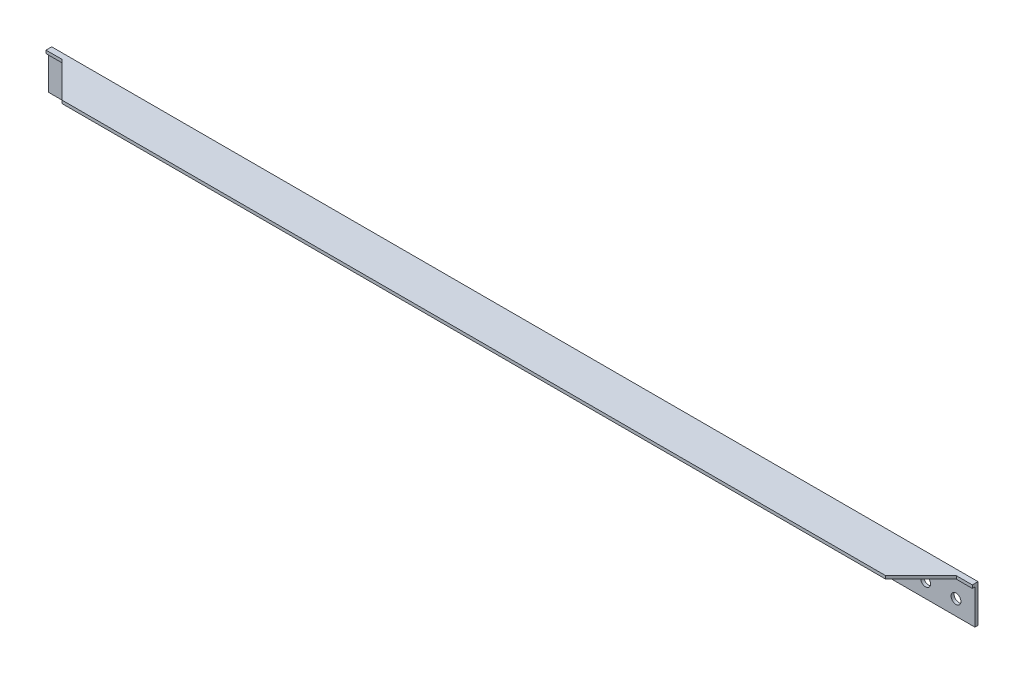
ISO-10303-21;
HEADER;
FILE_DESCRIPTION(('STEP AP214'),'2;1');
FILE_NAME('part.step','',(''),(''),'','','');
FILE_SCHEMA(('AUTOMOTIVE_DESIGN { 1 0 10303 214 1 1 1 1 }'));
ENDSEC;
DATA;
#1=APPLICATION_CONTEXT('core data for automotive mechanical design processes');
#2=APPLICATION_PROTOCOL_DEFINITION('international standard','automotive_design',2000,#1);
#3=PRODUCT_CONTEXT('',#1,'mechanical');
#4=PRODUCT('Part','Part','',(#3));
#5=PRODUCT_RELATED_PRODUCT_CATEGORY('part','',(#4));
#6=PRODUCT_DEFINITION_FORMATION('','',#4);
#7=PRODUCT_DEFINITION_CONTEXT('part definition',#1,'design');
#8=PRODUCT_DEFINITION('design','',#6,#7);
#9=PRODUCT_DEFINITION_SHAPE('','',#8);
#10=(LENGTH_UNIT() NAMED_UNIT(*) SI_UNIT(.MILLI.,.METRE.));
#11=(NAMED_UNIT(*) PLANE_ANGLE_UNIT() SI_UNIT($,.RADIAN.));
#12=(NAMED_UNIT(*) SI_UNIT($,.STERADIAN.) SOLID_ANGLE_UNIT());
#13=UNCERTAINTY_MEASURE_WITH_UNIT(LENGTH_MEASURE(1.E-05),#10,'distance_accuracy_value','');
#14=(GEOMETRIC_REPRESENTATION_CONTEXT(3) GLOBAL_UNCERTAINTY_ASSIGNED_CONTEXT((#13)) GLOBAL_UNIT_ASSIGNED_CONTEXT((#10,
#11,#12)) REPRESENTATION_CONTEXT('',''));
#15=CARTESIAN_POINT('',(0.,0.,0.));
#16=DIRECTION('',(0.,0.,1.));
#17=DIRECTION('',(1.,0.,0.));
#18=AXIS2_PLACEMENT_3D('',#15,#16,#17);
#19=CARTESIAN_POINT('',(-1220.,100.,8.));
#20=DIRECTION('',(0.,0.,-1.));
#21=DIRECTION('',(-1.,0.,0.));
#22=AXIS2_PLACEMENT_3D('',#19,#20,#21);
#23=PLANE('',#22);
#24=CARTESIAN_POINT('',(-80.,39.9999999999999,8.));
#25=DIRECTION('',(0.,0.,1.));
#26=DIRECTION('',(-1.,0.,0.));
#27=AXIS2_PLACEMENT_3D('',#24,#25,#26);
#28=CIRCLE('',#27,13.);
#29=CARTESIAN_POINT('',(-93.,39.9999999999999,8.));
#30=VERTEX_POINT('',#29);
#31=EDGE_CURVE('E143',#30,#30,#28,.T.);
#32=ORIENTED_EDGE('',*,*,#31,.F.);
#33=EDGE_LOOP('',(#32));
#34=FACE_BOUND('',#33,.T.);
#35=CARTESIAN_POINT('',(-160.,39.9999999999999,8.));
#36=DIRECTION('',(0.,0.,1.));
#37=DIRECTION('',(-1.,0.,0.));
#38=AXIS2_PLACEMENT_3D('',#35,#36,#37);
#39=CIRCLE('',#38,13.);
#40=CARTESIAN_POINT('',(-173.,39.9999999999999,8.));
#41=VERTEX_POINT('',#40);
#42=EDGE_CURVE('E149',#41,#41,#39,.T.);
#43=ORIENTED_EDGE('',*,*,#42,.F.);
#44=EDGE_LOOP('',(#43));
#45=FACE_BOUND('',#44,.T.);
#46=CARTESIAN_POINT('',(160.,39.9999999999999,8.));
#47=DIRECTION('',(0.,0.,1.));
#48=DIRECTION('',(1.,0.,0.));
#49=AXIS2_PLACEMENT_3D('',#46,#47,#48);
#50=CIRCLE('',#49,13.);
#51=CARTESIAN_POINT('',(173.,39.9999999999999,8.));
#52=VERTEX_POINT('',#51);
#53=EDGE_CURVE('E155',#52,#52,#50,.T.);
#54=ORIENTED_EDGE('',*,*,#53,.F.);
#55=EDGE_LOOP('',(#54));
#56=FACE_BOUND('',#55,.T.);
#57=CARTESIAN_POINT('',(80.,39.9999999999999,8.));
#58=DIRECTION('',(0.,0.,1.));
#59=DIRECTION('',(1.,0.,0.));
#60=AXIS2_PLACEMENT_3D('',#57,#58,#59);
#61=CIRCLE('',#60,13.);
#62=CARTESIAN_POINT('',(93.,39.9999999999999,8.));
#63=VERTEX_POINT('',#62);
#64=EDGE_CURVE('E161',#63,#63,#61,.T.);
#65=ORIENTED_EDGE('',*,*,#64,.F.);
#66=EDGE_LOOP('',(#65));
#67=FACE_BOUND('',#66,.T.);
#68=CARTESIAN_POINT('',(0.,39.9999999999999,8.));
#69=DIRECTION('',(0.,0.,1.));
#70=DIRECTION('',(1.,0.,0.));
#71=AXIS2_PLACEMENT_3D('',#68,#69,#70);
#72=CIRCLE('',#71,13.);
#73=CARTESIAN_POINT('',(13.,39.9999999999999,8.));
#74=VERTEX_POINT('',#73);
#75=EDGE_CURVE('E167',#74,#74,#72,.T.);
#76=ORIENTED_EDGE('',*,*,#75,.F.);
#77=EDGE_LOOP('',(#76));
#78=FACE_BOUND('',#77,.T.);
#79=CARTESIAN_POINT('',(-1090.,40.,8.));
#80=DIRECTION('',(0.,0.,1.));
#81=DIRECTION('',(-1.,0.,0.));
#82=AXIS2_PLACEMENT_3D('',#79,#80,#81);
#83=CIRCLE('',#82,12.9999999999998);
#84=CARTESIAN_POINT('',(-1103.,40.,8.));
#85=VERTEX_POINT('',#84);
#86=EDGE_CURVE('E173',#85,#85,#83,.T.);
#87=ORIENTED_EDGE('',*,*,#86,.F.);
#88=EDGE_LOOP('',(#87));
#89=FACE_BOUND('',#88,.T.);
#90=CARTESIAN_POINT('',(-1170.,40.,8.));
#91=DIRECTION('',(0.,0.,1.));
#92=DIRECTION('',(-1.,0.,0.));
#93=AXIS2_PLACEMENT_3D('',#90,#91,#92);
#94=CIRCLE('',#93,12.9999999999998);
#95=CARTESIAN_POINT('',(-1183.,40.,8.));
#96=VERTEX_POINT('',#95);
#97=EDGE_CURVE('E179',#96,#96,#94,.T.);
#98=ORIENTED_EDGE('',*,*,#97,.F.);
#99=EDGE_LOOP('',(#98));
#100=FACE_BOUND('',#99,.T.);
#101=CARTESIAN_POINT('',(1170.,40.,8.));
#102=DIRECTION('',(0.,0.,1.));
#103=DIRECTION('',(1.,0.,0.));
#104=AXIS2_PLACEMENT_3D('',#101,#102,#103);
#105=CIRCLE('',#104,12.9999999999998);
#106=CARTESIAN_POINT('',(1183.,40.,8.));
#107=VERTEX_POINT('',#106);
#108=EDGE_CURVE('E185',#107,#107,#105,.T.);
#109=ORIENTED_EDGE('',*,*,#108,.F.);
#110=EDGE_LOOP('',(#109));
#111=FACE_BOUND('',#110,.T.);
#112=CARTESIAN_POINT('',(1090.,40.,8.));
#113=DIRECTION('',(0.,0.,1.));
#114=DIRECTION('',(1.,0.,0.));
#115=AXIS2_PLACEMENT_3D('',#112,#113,#114);
#116=CIRCLE('',#115,12.9999999999998);
#117=CARTESIAN_POINT('',(1103.,40.,8.));
#118=VERTEX_POINT('',#117);
#119=EDGE_CURVE('E191',#118,#118,#116,.T.);
#120=ORIENTED_EDGE('',*,*,#119,.F.);
#121=EDGE_LOOP('',(#120));
#122=FACE_BOUND('',#121,.T.);
#123=DIRECTION('',(1.,0.,0.));
#124=VECTOR('',#123,1.);
#125=CARTESIAN_POINT('',(-1220.,92.,8.));
#126=LINE('',#125,#124);
#127=CARTESIAN_POINT('',(-1220.,92.,8.));
#128=VERTEX_POINT('',#127);
#129=CARTESIAN_POINT('',(1220.,92.,8.));
#130=VERTEX_POINT('',#129);
#131=EDGE_CURVE('E134',#128,#130,#126,.T.);
#132=ORIENTED_EDGE('',*,*,#131,.F.);
#133=DIRECTION('',(0.,-1.,0.));
#134=VECTOR('',#133,1.);
#135=CARTESIAN_POINT('',(-1220.,0.,8.));
#136=LINE('',#135,#134);
#137=CARTESIAN_POINT('',(-1220.,0.,8.));
#138=VERTEX_POINT('',#137);
#139=EDGE_CURVE('E197',#128,#138,#136,.T.);
#140=ORIENTED_EDGE('',*,*,#139,.T.);
#141=DIRECTION('',(1.,0.,0.));
#142=VECTOR('',#141,1.);
#143=CARTESIAN_POINT('',(-1220.,0.,8.));
#144=LINE('',#143,#142);
#145=CARTESIAN_POINT('',(1220.,0.,8.));
#146=VERTEX_POINT('',#145);
#147=EDGE_CURVE('E199',#138,#146,#144,.T.);
#148=ORIENTED_EDGE('',*,*,#147,.T.);
#149=DIRECTION('',(0.,1.,0.));
#150=VECTOR('',#149,1.);
#151=CARTESIAN_POINT('',(1220.,0.,8.));
#152=LINE('',#151,#150);
#153=EDGE_CURVE('E202',#146,#130,#152,.T.);
#154=ORIENTED_EDGE('',*,*,#153,.T.);
#155=EDGE_LOOP('',(#132,#140,#148,#154));
#156=FACE_BOUND('',#155,.T.);
#157=ADVANCED_FACE('F35',(#34,#45,#56,#67,#78,#89,#100,#111,#122,#156),#23,.F.);
#158=CARTESIAN_POINT('',(-1220.,100.,0.));
#159=DIRECTION('',(0.,0.,-1.));
#160=DIRECTION('',(-1.,0.,0.));
#161=AXIS2_PLACEMENT_3D('',#158,#159,#160);
#162=PLANE('',#161);
#163=CARTESIAN_POINT('',(-160.,39.9999999999999,0.));
#164=DIRECTION('',(0.,0.,1.));
#165=DIRECTION('',(-1.,0.,0.));
#166=AXIS2_PLACEMENT_3D('',#163,#164,#165);
#167=CIRCLE('',#166,13.);
#168=CARTESIAN_POINT('',(-173.,39.9999999999999,0.));
#169=VERTEX_POINT('',#168);
#170=EDGE_CURVE('E146',#169,#169,#167,.T.);
#171=ORIENTED_EDGE('',*,*,#170,.T.);
#172=EDGE_LOOP('',(#171));
#173=FACE_BOUND('',#172,.T.);
#174=CARTESIAN_POINT('',(80.,39.9999999999999,0.));
#175=DIRECTION('',(0.,0.,1.));
#176=DIRECTION('',(1.,0.,0.));
#177=AXIS2_PLACEMENT_3D('',#174,#175,#176);
#178=CIRCLE('',#177,13.);
#179=CARTESIAN_POINT('',(93.,39.9999999999999,0.));
#180=VERTEX_POINT('',#179);
#181=EDGE_CURVE('E158',#180,#180,#178,.T.);
#182=ORIENTED_EDGE('',*,*,#181,.T.);
#183=EDGE_LOOP('',(#182));
#184=FACE_BOUND('',#183,.T.);
#185=CARTESIAN_POINT('',(-1090.,40.,0.));
#186=DIRECTION('',(0.,0.,1.));
#187=DIRECTION('',(-1.,0.,0.));
#188=AXIS2_PLACEMENT_3D('',#185,#186,#187);
#189=CIRCLE('',#188,12.9999999999998);
#190=CARTESIAN_POINT('',(-1103.,40.,0.));
#191=VERTEX_POINT('',#190);
#192=EDGE_CURVE('E170',#191,#191,#189,.T.);
#193=ORIENTED_EDGE('',*,*,#192,.T.);
#194=EDGE_LOOP('',(#193));
#195=FACE_BOUND('',#194,.T.);
#196=CARTESIAN_POINT('',(1170.,40.,0.));
#197=DIRECTION('',(0.,0.,1.));
#198=DIRECTION('',(1.,0.,0.));
#199=AXIS2_PLACEMENT_3D('',#196,#197,#198);
#200=CIRCLE('',#199,12.9999999999998);
#201=CARTESIAN_POINT('',(1183.,40.,0.));
#202=VERTEX_POINT('',#201);
#203=EDGE_CURVE('E182',#202,#202,#200,.T.);
#204=ORIENTED_EDGE('',*,*,#203,.T.);
#205=EDGE_LOOP('',(#204));
#206=FACE_BOUND('',#205,.T.);
#207=DIRECTION('',(0.,-1.,0.));
#208=VECTOR('',#207,1.);
#209=CARTESIAN_POINT('',(-1220.,0.,0.));
#210=LINE('',#209,#208);
#211=CARTESIAN_POINT('',(-1220.,100.,0.));
#212=VERTEX_POINT('',#211);
#213=CARTESIAN_POINT('',(-1220.,0.,0.));
#214=VERTEX_POINT('',#213);
#215=EDGE_CURVE('E194',#212,#214,#210,.T.);
#216=ORIENTED_EDGE('',*,*,#215,.F.);
#217=DIRECTION('',(-1.,0.,0.));
#218=VECTOR('',#217,1.);
#219=CARTESIAN_POINT('',(-1220.,100.,0.));
#220=LINE('',#219,#218);
#221=CARTESIAN_POINT('',(1220.,100.,0.));
#222=VERTEX_POINT('',#221);
#223=EDGE_CURVE('E200',#222,#212,#220,.T.);
#224=ORIENTED_EDGE('',*,*,#223,.F.);
#225=DIRECTION('',(0.,1.,0.));
#226=VECTOR('',#225,1.);
#227=CARTESIAN_POINT('',(1220.,0.,0.));
#228=LINE('',#227,#226);
#229=CARTESIAN_POINT('',(1220.,0.,0.));
#230=VERTEX_POINT('',#229);
#231=EDGE_CURVE('E210',#230,#222,#228,.T.);
#232=ORIENTED_EDGE('',*,*,#231,.F.);
#233=DIRECTION('',(1.,0.,0.));
#234=VECTOR('',#233,1.);
#235=CARTESIAN_POINT('',(-1220.,0.,0.));
#236=LINE('',#235,#234);
#237=EDGE_CURVE('E208',#214,#230,#236,.T.);
#238=ORIENTED_EDGE('',*,*,#237,.F.);
#239=EDGE_LOOP('',(#216,#224,#232,#238));
#240=FACE_BOUND('',#239,.T.);
#241=CARTESIAN_POINT('',(1090.,40.,0.));
#242=DIRECTION('',(0.,0.,1.));
#243=DIRECTION('',(1.,0.,0.));
#244=AXIS2_PLACEMENT_3D('',#241,#242,#243);
#245=CIRCLE('',#244,12.9999999999998);
#246=CARTESIAN_POINT('',(1103.,40.,0.));
#247=VERTEX_POINT('',#246);
#248=EDGE_CURVE('E188',#247,#247,#245,.T.);
#249=ORIENTED_EDGE('',*,*,#248,.T.);
#250=EDGE_LOOP('',(#249));
#251=FACE_BOUND('',#250,.T.);
#252=CARTESIAN_POINT('',(-1170.,40.,0.));
#253=DIRECTION('',(0.,0.,1.));
#254=DIRECTION('',(-1.,0.,0.));
#255=AXIS2_PLACEMENT_3D('',#252,#253,#254);
#256=CIRCLE('',#255,12.9999999999998);
#257=CARTESIAN_POINT('',(-1183.,40.,0.));
#258=VERTEX_POINT('',#257);
#259=EDGE_CURVE('E176',#258,#258,#256,.T.);
#260=ORIENTED_EDGE('',*,*,#259,.T.);
#261=EDGE_LOOP('',(#260));
#262=FACE_BOUND('',#261,.T.);
#263=CARTESIAN_POINT('',(0.,39.9999999999999,0.));
#264=DIRECTION('',(0.,0.,1.));
#265=DIRECTION('',(1.,0.,0.));
#266=AXIS2_PLACEMENT_3D('',#263,#264,#265);
#267=CIRCLE('',#266,13.);
#268=CARTESIAN_POINT('',(13.,39.9999999999999,0.));
#269=VERTEX_POINT('',#268);
#270=EDGE_CURVE('E164',#269,#269,#267,.T.);
#271=ORIENTED_EDGE('',*,*,#270,.T.);
#272=EDGE_LOOP('',(#271));
#273=FACE_BOUND('',#272,.T.);
#274=CARTESIAN_POINT('',(160.,39.9999999999999,0.));
#275=DIRECTION('',(0.,0.,1.));
#276=DIRECTION('',(1.,0.,0.));
#277=AXIS2_PLACEMENT_3D('',#274,#275,#276);
#278=CIRCLE('',#277,13.);
#279=CARTESIAN_POINT('',(173.,39.9999999999999,0.));
#280=VERTEX_POINT('',#279);
#281=EDGE_CURVE('E152',#280,#280,#278,.T.);
#282=ORIENTED_EDGE('',*,*,#281,.T.);
#283=EDGE_LOOP('',(#282));
#284=FACE_BOUND('',#283,.T.);
#285=CARTESIAN_POINT('',(-80.,39.9999999999999,0.));
#286=DIRECTION('',(0.,0.,1.));
#287=DIRECTION('',(-1.,0.,0.));
#288=AXIS2_PLACEMENT_3D('',#285,#286,#287);
#289=CIRCLE('',#288,13.);
#290=CARTESIAN_POINT('',(-93.,39.9999999999999,0.));
#291=VERTEX_POINT('',#290);
#292=EDGE_CURVE('E142',#291,#291,#289,.T.);
#293=ORIENTED_EDGE('',*,*,#292,.T.);
#294=EDGE_LOOP('',(#293));
#295=FACE_BOUND('',#294,.T.);
#296=ADVANCED_FACE('F263',(#173,#184,#195,#206,#240,#251,#262,#273,#284,#295),#162,.T.);
#297=CARTESIAN_POINT('',(-1220.,0.,8.));
#298=DIRECTION('',(1.,0.,0.));
#299=DIRECTION('',(0.,0.,-1.));
#300=AXIS2_PLACEMENT_3D('',#297,#298,#299);
#301=PLANE('',#300);
#302=DIRECTION('',(0.,0.,-1.));
#303=VECTOR('',#302,1.);
#304=CARTESIAN_POINT('',(-1220.,92.,108.));
#305=LINE('',#304,#303);
#306=CARTESIAN_POINT('',(-1220.,92.,15.));
#307=VERTEX_POINT('',#306);
#308=EDGE_CURVE('E132',#307,#128,#305,.T.);
#309=ORIENTED_EDGE('',*,*,#308,.F.);
#310=DIRECTION('',(0.,1.,0.));
#311=VECTOR('',#310,1.);
#312=CARTESIAN_POINT('',(-1220.,0.,15.));
#313=LINE('',#312,#311);
#314=CARTESIAN_POINT('',(-1220.,100.,15.));
#315=VERTEX_POINT('',#314);
#316=EDGE_CURVE('E249',#307,#315,#313,.T.);
#317=ORIENTED_EDGE('',*,*,#316,.T.);
#318=DIRECTION('',(0.,0.,-1.));
#319=VECTOR('',#318,1.);
#320=CARTESIAN_POINT('',(-1220.,100.,8.));
#321=LINE('',#320,#319);
#322=EDGE_CURVE('E205',#315,#212,#321,.T.);
#323=ORIENTED_EDGE('',*,*,#322,.T.);
#324=ORIENTED_EDGE('',*,*,#215,.T.);
#325=DIRECTION('',(0.,0.,-1.));
#326=VECTOR('',#325,1.);
#327=CARTESIAN_POINT('',(-1220.,0.,8.));
#328=LINE('',#327,#326);
#329=EDGE_CURVE('E221',#138,#214,#328,.T.);
#330=ORIENTED_EDGE('',*,*,#329,.F.);
#331=ORIENTED_EDGE('',*,*,#139,.F.);
#332=EDGE_LOOP('',(#309,#317,#323,#324,#330,#331));
#333=FACE_BOUND('',#332,.T.);
#334=ADVANCED_FACE('F37',(#333),#301,.F.);
#335=CARTESIAN_POINT('',(-1220.,0.,8.));
#336=DIRECTION('',(0.,1.,0.));
#337=DIRECTION('',(0.,0.,1.));
#338=AXIS2_PLACEMENT_3D('',#335,#336,#337);
#339=PLANE('',#338);
#340=ORIENTED_EDGE('',*,*,#237,.T.);
#341=DIRECTION('',(0.,0.,-1.));
#342=VECTOR('',#341,1.);
#343=CARTESIAN_POINT('',(1220.,0.,8.));
#344=LINE('',#343,#342);
#345=EDGE_CURVE('E218',#146,#230,#344,.T.);
#346=ORIENTED_EDGE('',*,*,#345,.F.);
#347=ORIENTED_EDGE('',*,*,#147,.F.);
#348=ORIENTED_EDGE('',*,*,#329,.T.);
#349=EDGE_LOOP('',(#340,#346,#347,#348));
#350=FACE_BOUND('',#349,.T.);
#351=ADVANCED_FACE('F268',(#350),#339,.F.);
#352=CARTESIAN_POINT('',(1220.,0.,8.));
#353=DIRECTION('',(-1.,0.,0.));
#354=DIRECTION('',(0.,0.,1.));
#355=AXIS2_PLACEMENT_3D('',#352,#353,#354);
#356=PLANE('',#355);
#357=DIRECTION('',(0.,0.,-1.));
#358=VECTOR('',#357,1.);
#359=CARTESIAN_POINT('',(1220.,100.,8.));
#360=LINE('',#359,#358);
#361=CARTESIAN_POINT('',(1220.,100.,15.));
#362=VERTEX_POINT('',#361);
#363=EDGE_CURVE('E216',#362,#222,#360,.T.);
#364=ORIENTED_EDGE('',*,*,#363,.F.);
#365=DIRECTION('',(0.,1.,0.));
#366=VECTOR('',#365,1.);
#367=CARTESIAN_POINT('',(1220.,0.,15.));
#368=LINE('',#367,#366);
#369=CARTESIAN_POINT('',(1220.,92.,15.));
#370=VERTEX_POINT('',#369);
#371=EDGE_CURVE('E235',#370,#362,#368,.T.);
#372=ORIENTED_EDGE('',*,*,#371,.F.);
#373=DIRECTION('',(0.,0.,-1.));
#374=VECTOR('',#373,1.);
#375=CARTESIAN_POINT('',(1220.,92.,108.));
#376=LINE('',#375,#374);
#377=EDGE_CURVE('E129',#370,#130,#376,.T.);
#378=ORIENTED_EDGE('',*,*,#377,.T.);
#379=ORIENTED_EDGE('',*,*,#153,.F.);
#380=ORIENTED_EDGE('',*,*,#345,.T.);
#381=ORIENTED_EDGE('',*,*,#231,.T.);
#382=EDGE_LOOP('',(#364,#372,#378,#379,#380,#381));
#383=FACE_BOUND('',#382,.T.);
#384=ADVANCED_FACE('F240',(#383),#356,.F.);
#385=CARTESIAN_POINT('',(-1220.,100.,8.));
#386=DIRECTION('',(0.,-1.,0.));
#387=DIRECTION('',(0.,0.,-1.));
#388=AXIS2_PLACEMENT_3D('',#385,#386,#387);
#389=PLANE('',#388);
#390=ORIENTED_EDGE('',*,*,#322,.F.);
#391=DIRECTION('',(-1.,0.,0.));
#392=VECTOR('',#391,1.);
#393=CARTESIAN_POINT('',(-1220.,100.,15.));
#394=LINE('',#393,#392);
#395=CARTESIAN_POINT('',(-1178.,100.,15.));
#396=VERTEX_POINT('',#395);
#397=EDGE_CURVE('E125',#396,#315,#394,.T.);
#398=ORIENTED_EDGE('',*,*,#397,.F.);
#399=DIRECTION('',(-0.707106781186552,0.,-0.707106781186543));
#400=VECTOR('',#399,1.);
#401=CARTESIAN_POINT('',(-1085.,100.,108.));
#402=LINE('',#401,#400);
#403=CARTESIAN_POINT('',(-1085.,100.,108.));
#404=VERTEX_POINT('',#403);
#405=EDGE_CURVE('E114',#404,#396,#402,.T.);
#406=ORIENTED_EDGE('',*,*,#405,.F.);
#407=DIRECTION('',(-1.,0.,0.));
#408=VECTOR('',#407,1.);
#409=CARTESIAN_POINT('',(-1220.,100.,108.));
#410=LINE('',#409,#408);
#411=CARTESIAN_POINT('',(1085.,100.,108.));
#412=VERTEX_POINT('',#411);
#413=EDGE_CURVE('E124',#412,#404,#410,.T.);
#414=ORIENTED_EDGE('',*,*,#413,.F.);
#415=DIRECTION('',(-0.707106781186551,0.,0.707106781186544));
#416=VECTOR('',#415,1.);
#417=CARTESIAN_POINT('',(1085.,100.,108.));
#418=LINE('',#417,#416);
#419=CARTESIAN_POINT('',(1178.,100.,15.));
#420=VERTEX_POINT('',#419);
#421=EDGE_CURVE('E58',#420,#412,#418,.T.);
#422=ORIENTED_EDGE('',*,*,#421,.F.);
#423=DIRECTION('',(-1.,0.,0.));
#424=VECTOR('',#423,1.);
#425=CARTESIAN_POINT('',(1220.,100.,15.));
#426=LINE('',#425,#424);
#427=EDGE_CURVE('E244',#362,#420,#426,.T.);
#428=ORIENTED_EDGE('',*,*,#427,.F.);
#429=ORIENTED_EDGE('',*,*,#363,.T.);
#430=ORIENTED_EDGE('',*,*,#223,.T.);
#431=EDGE_LOOP('',(#390,#398,#406,#414,#422,#428,#429,#430));
#432=FACE_BOUND('',#431,.T.);
#433=ADVANCED_FACE('F123',(#432),#389,.F.);
#434=CARTESIAN_POINT('',(1090.,40.,8.));
#435=DIRECTION('',(0.,0.,-1.));
#436=DIRECTION('',(-1.,0.,0.));
#437=AXIS2_PLACEMENT_3D('',#434,#435,#436);
#438=CYLINDRICAL_SURFACE('',#437,12.9999999999998);
#439=ORIENTED_EDGE('',*,*,#119,.T.);
#440=EDGE_LOOP('',(#439));
#441=FACE_BOUND('',#440,.T.);
#442=ORIENTED_EDGE('',*,*,#248,.F.);
#443=EDGE_LOOP('',(#442));
#444=FACE_BOUND('',#443,.T.);
#445=ADVANCED_FACE('F293',(#441,#444),#438,.F.);
#446=CARTESIAN_POINT('',(1170.,40.,8.));
#447=DIRECTION('',(0.,0.,-1.));
#448=DIRECTION('',(-1.,0.,0.));
#449=AXIS2_PLACEMENT_3D('',#446,#447,#448);
#450=CYLINDRICAL_SURFACE('',#449,12.9999999999998);
#451=ORIENTED_EDGE('',*,*,#108,.T.);
#452=EDGE_LOOP('',(#451));
#453=FACE_BOUND('',#452,.T.);
#454=ORIENTED_EDGE('',*,*,#203,.F.);
#455=EDGE_LOOP('',(#454));
#456=FACE_BOUND('',#455,.T.);
#457=ADVANCED_FACE('F325',(#453,#456),#450,.F.);
#458=CARTESIAN_POINT('',(-1170.,40.,8.));
#459=DIRECTION('',(0.,0.,-1.));
#460=DIRECTION('',(-1.,0.,0.));
#461=AXIS2_PLACEMENT_3D('',#458,#459,#460);
#462=CYLINDRICAL_SURFACE('',#461,12.9999999999998);
#463=ORIENTED_EDGE('',*,*,#97,.T.);
#464=EDGE_LOOP('',(#463));
#465=FACE_BOUND('',#464,.T.);
#466=ORIENTED_EDGE('',*,*,#259,.F.);
#467=EDGE_LOOP('',(#466));
#468=FACE_BOUND('',#467,.T.);
#469=ADVANCED_FACE('F335',(#465,#468),#462,.F.);
#470=CARTESIAN_POINT('',(-1090.,40.,8.));
#471=DIRECTION('',(0.,0.,-1.));
#472=DIRECTION('',(-1.,0.,0.));
#473=AXIS2_PLACEMENT_3D('',#470,#471,#472);
#474=CYLINDRICAL_SURFACE('',#473,12.9999999999998);
#475=ORIENTED_EDGE('',*,*,#86,.T.);
#476=EDGE_LOOP('',(#475));
#477=FACE_BOUND('',#476,.T.);
#478=ORIENTED_EDGE('',*,*,#192,.F.);
#479=EDGE_LOOP('',(#478));
#480=FACE_BOUND('',#479,.T.);
#481=ADVANCED_FACE('F344',(#477,#480),#474,.F.);
#482=CARTESIAN_POINT('',(0.,39.9999999999999,8.));
#483=DIRECTION('',(0.,0.,-1.));
#484=DIRECTION('',(-1.,0.,0.));
#485=AXIS2_PLACEMENT_3D('',#482,#483,#484);
#486=CYLINDRICAL_SURFACE('',#485,13.);
#487=ORIENTED_EDGE('',*,*,#75,.T.);
#488=EDGE_LOOP('',(#487));
#489=FACE_BOUND('',#488,.T.);
#490=ORIENTED_EDGE('',*,*,#270,.F.);
#491=EDGE_LOOP('',(#490));
#492=FACE_BOUND('',#491,.T.);
#493=ADVANCED_FACE('F354',(#489,#492),#486,.F.);
#494=CARTESIAN_POINT('',(80.,39.9999999999999,8.));
#495=DIRECTION('',(0.,0.,-1.));
#496=DIRECTION('',(-1.,0.,0.));
#497=AXIS2_PLACEMENT_3D('',#494,#495,#496);
#498=CYLINDRICAL_SURFACE('',#497,13.);
#499=ORIENTED_EDGE('',*,*,#64,.T.);
#500=EDGE_LOOP('',(#499));
#501=FACE_BOUND('',#500,.T.);
#502=ORIENTED_EDGE('',*,*,#181,.F.);
#503=EDGE_LOOP('',(#502));
#504=FACE_BOUND('',#503,.T.);
#505=ADVANCED_FACE('F364',(#501,#504),#498,.F.);
#506=CARTESIAN_POINT('',(160.,39.9999999999999,8.));
#507=DIRECTION('',(0.,0.,-1.));
#508=DIRECTION('',(-1.,0.,0.));
#509=AXIS2_PLACEMENT_3D('',#506,#507,#508);
#510=CYLINDRICAL_SURFACE('',#509,13.);
#511=ORIENTED_EDGE('',*,*,#53,.T.);
#512=EDGE_LOOP('',(#511));
#513=FACE_BOUND('',#512,.T.);
#514=ORIENTED_EDGE('',*,*,#281,.F.);
#515=EDGE_LOOP('',(#514));
#516=FACE_BOUND('',#515,.T.);
#517=ADVANCED_FACE('F374',(#513,#516),#510,.F.);
#518=CARTESIAN_POINT('',(-160.,39.9999999999999,8.));
#519=DIRECTION('',(0.,0.,-1.));
#520=DIRECTION('',(-1.,0.,0.));
#521=AXIS2_PLACEMENT_3D('',#518,#519,#520);
#522=CYLINDRICAL_SURFACE('',#521,13.);
#523=ORIENTED_EDGE('',*,*,#42,.T.);
#524=EDGE_LOOP('',(#523));
#525=FACE_BOUND('',#524,.T.);
#526=ORIENTED_EDGE('',*,*,#170,.F.);
#527=EDGE_LOOP('',(#526));
#528=FACE_BOUND('',#527,.T.);
#529=ADVANCED_FACE('F384',(#525,#528),#522,.F.);
#530=CARTESIAN_POINT('',(-80.,39.9999999999999,8.));
#531=DIRECTION('',(0.,0.,-1.));
#532=DIRECTION('',(-1.,0.,0.));
#533=AXIS2_PLACEMENT_3D('',#530,#531,#532);
#534=CYLINDRICAL_SURFACE('',#533,13.);
#535=ORIENTED_EDGE('',*,*,#31,.T.);
#536=EDGE_LOOP('',(#535));
#537=FACE_BOUND('',#536,.T.);
#538=ORIENTED_EDGE('',*,*,#292,.F.);
#539=EDGE_LOOP('',(#538));
#540=FACE_BOUND('',#539,.T.);
#541=ADVANCED_FACE('F394',(#537,#540),#534,.F.);
#542=CARTESIAN_POINT('',(-1220.,92.,108.));
#543=DIRECTION('',(0.,1.,0.));
#544=DIRECTION('',(0.,0.,1.));
#545=AXIS2_PLACEMENT_3D('',#542,#543,#544);
#546=PLANE('',#545);
#547=DIRECTION('',(-0.707106781186552,0.,-0.707106781186543));
#548=VECTOR('',#547,1.);
#549=CARTESIAN_POINT('',(-1152.5,92.,40.5));
#550=LINE('',#549,#548);
#551=CARTESIAN_POINT('',(-1085.,92.,108.));
#552=VERTEX_POINT('',#551);
#553=CARTESIAN_POINT('',(-1178.,92.,15.));
#554=VERTEX_POINT('',#553);
#555=EDGE_CURVE('E50',#552,#554,#550,.T.);
#556=ORIENTED_EDGE('',*,*,#555,.T.);
#557=DIRECTION('',(-1.,0.,0.));
#558=VECTOR('',#557,1.);
#559=CARTESIAN_POINT('',(-1220.,92.,15.));
#560=LINE('',#559,#558);
#561=EDGE_CURVE('E11',#554,#307,#560,.T.);
#562=ORIENTED_EDGE('',*,*,#561,.T.);
#563=ORIENTED_EDGE('',*,*,#308,.T.);
#564=ORIENTED_EDGE('',*,*,#131,.T.);
#565=ORIENTED_EDGE('',*,*,#377,.F.);
#566=DIRECTION('',(-1.,0.,0.));
#567=VECTOR('',#566,1.);
#568=CARTESIAN_POINT('',(-1220.,92.,15.0000000000007));
#569=LINE('',#568,#567);
#570=CARTESIAN_POINT('',(1178.,92.,15.));
#571=VERTEX_POINT('',#570);
#572=EDGE_CURVE('E119',#370,#571,#569,.T.);
#573=ORIENTED_EDGE('',*,*,#572,.T.);
#574=DIRECTION('',(-0.707106781186551,0.,0.707106781186544));
#575=VECTOR('',#574,1.);
#576=CARTESIAN_POINT('',(-67.5000000000108,92.,1260.5));
#577=LINE('',#576,#575);
#578=CARTESIAN_POINT('',(1085.,92.,108.));
#579=VERTEX_POINT('',#578);
#580=EDGE_CURVE('E139',#571,#579,#577,.T.);
#581=ORIENTED_EDGE('',*,*,#580,.T.);
#582=DIRECTION('',(1.,0.,0.));
#583=VECTOR('',#582,1.);
#584=CARTESIAN_POINT('',(-1220.,92.,108.));
#585=LINE('',#584,#583);
#586=EDGE_CURVE('E130',#552,#579,#585,.T.);
#587=ORIENTED_EDGE('',*,*,#586,.F.);
#588=EDGE_LOOP('',(#556,#562,#563,#564,#565,#573,#581,#587));
#589=FACE_BOUND('',#588,.T.);
#590=ADVANCED_FACE('F229',(#589),#546,.F.);
#591=CARTESIAN_POINT('',(-1220.,92.,108.));
#592=DIRECTION('',(0.,0.,1.));
#593=DIRECTION('',(1.,0.,0.));
#594=AXIS2_PLACEMENT_3D('',#591,#592,#593);
#595=PLANE('',#594);
#596=DIRECTION('',(0.,1.,0.));
#597=VECTOR('',#596,1.);
#598=CARTESIAN_POINT('',(-1085.,92.,108.));
#599=LINE('',#598,#597);
#600=EDGE_CURVE('E43',#552,#404,#599,.T.);
#601=ORIENTED_EDGE('',*,*,#600,.F.);
#602=ORIENTED_EDGE('',*,*,#586,.T.);
#603=DIRECTION('',(0.,-1.,0.));
#604=VECTOR('',#603,1.);
#605=CARTESIAN_POINT('',(1085.,92.,108.));
#606=LINE('',#605,#604);
#607=EDGE_CURVE('E128',#412,#579,#606,.T.);
#608=ORIENTED_EDGE('',*,*,#607,.F.);
#609=ORIENTED_EDGE('',*,*,#413,.T.);
#610=EDGE_LOOP('',(#601,#602,#608,#609));
#611=FACE_BOUND('',#610,.T.);
#612=ADVANCED_FACE('F127',(#611),#595,.T.);
#613=CARTESIAN_POINT('',(1220.,0.,15.));
#614=DIRECTION('',(0.,0.,-1.));
#615=DIRECTION('',(-1.,0.,0.));
#616=AXIS2_PLACEMENT_3D('',#613,#614,#615);
#617=PLANE('',#616);
#618=ORIENTED_EDGE('',*,*,#371,.T.);
#619=ORIENTED_EDGE('',*,*,#427,.T.);
#620=DIRECTION('',(0.,1.,0.));
#621=VECTOR('',#620,1.);
#622=CARTESIAN_POINT('',(1178.,0.,15.));
#623=LINE('',#622,#621);
#624=EDGE_CURVE('E237',#571,#420,#623,.T.);
#625=ORIENTED_EDGE('',*,*,#624,.F.);
#626=ORIENTED_EDGE('',*,*,#572,.F.);
#627=EDGE_LOOP('',(#618,#619,#625,#626));
#628=FACE_BOUND('',#627,.T.);
#629=ADVANCED_FACE('F233',(#628),#617,.F.);
#630=CARTESIAN_POINT('',(1085.,0.,108.));
#631=DIRECTION('',(-0.707106781186544,0.,-0.707106781186551));
#632=DIRECTION('',(-0.707106781186551,0.,0.707106781186544));
#633=AXIS2_PLACEMENT_3D('',#630,#631,#632);
#634=PLANE('',#633);
#635=ORIENTED_EDGE('',*,*,#624,.T.);
#636=ORIENTED_EDGE('',*,*,#421,.T.);
#637=ORIENTED_EDGE('',*,*,#607,.T.);
#638=ORIENTED_EDGE('',*,*,#580,.F.);
#639=EDGE_LOOP('',(#635,#636,#637,#638));
#640=FACE_BOUND('',#639,.T.);
#641=ADVANCED_FACE('F272',(#640),#634,.F.);
#642=CARTESIAN_POINT('',(-1220.,0.,15.));
#643=DIRECTION('',(0.,0.,-1.));
#644=DIRECTION('',(-1.,0.,0.));
#645=AXIS2_PLACEMENT_3D('',#642,#643,#644);
#646=PLANE('',#645);
#647=DIRECTION('',(0.,1.,0.));
#648=VECTOR('',#647,1.);
#649=CARTESIAN_POINT('',(-1178.,0.,15.));
#650=LINE('',#649,#648);
#651=EDGE_CURVE('E250',#554,#396,#650,.T.);
#652=ORIENTED_EDGE('',*,*,#651,.T.);
#653=ORIENTED_EDGE('',*,*,#397,.T.);
#654=ORIENTED_EDGE('',*,*,#316,.F.);
#655=ORIENTED_EDGE('',*,*,#561,.F.);
#656=EDGE_LOOP('',(#652,#653,#654,#655));
#657=FACE_BOUND('',#656,.T.);
#658=ADVANCED_FACE('F255',(#657),#646,.F.);
#659=CARTESIAN_POINT('',(-1085.,0.,108.));
#660=DIRECTION('',(0.707106781186543,0.,-0.707106781186552));
#661=DIRECTION('',(-0.707106781186552,0.,-0.707106781186543));
#662=AXIS2_PLACEMENT_3D('',#659,#660,#661);
#663=PLANE('',#662);
#664=ORIENTED_EDGE('',*,*,#600,.T.);
#665=ORIENTED_EDGE('',*,*,#405,.T.);
#666=ORIENTED_EDGE('',*,*,#651,.F.);
#667=ORIENTED_EDGE('',*,*,#555,.F.);
#668=EDGE_LOOP('',(#664,#665,#666,#667));
#669=FACE_BOUND('',#668,.T.);
#670=ADVANCED_FACE('F113',(#669),#663,.F.);
#671=CLOSED_SHELL('',(#157,#296,#334,#351,#384,#433,#445,#457,#469,#481,#493,#505,#517,#529,
#541,#590,#612,#629,#641,#658,#670));
#672=MANIFOLD_SOLID_BREP('B2',#671);
#673=ADVANCED_BREP_SHAPE_REPRESENTATION('',(#18,#672),#14);
#674=SHAPE_DEFINITION_REPRESENTATION(#9,#673);
ENDSEC;
END-ISO-10303-21;
